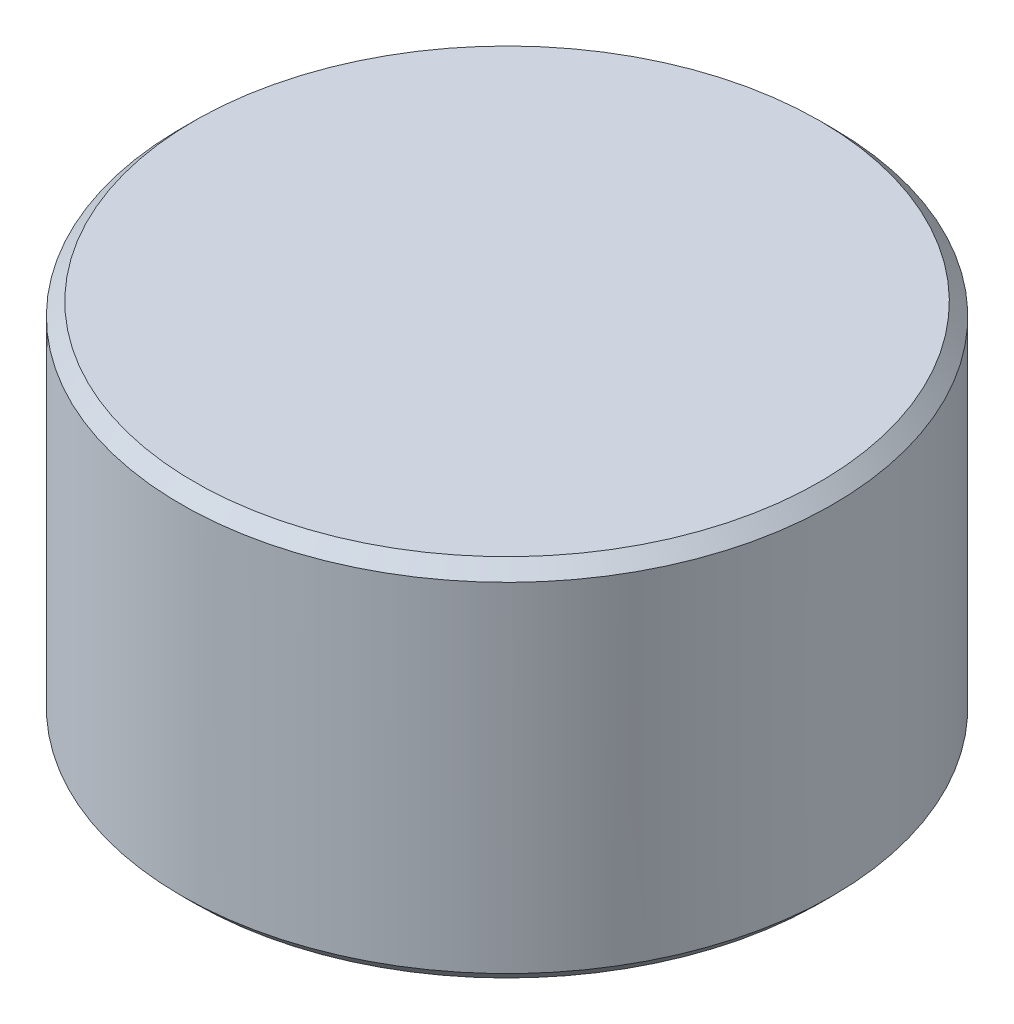
ISO-10303-21;
HEADER;
FILE_DESCRIPTION(('STEP AP214'),'2;1');
FILE_NAME('part.step','',(''),(''),'','','');
FILE_SCHEMA(('AUTOMOTIVE_DESIGN { 1 0 10303 214 1 1 1 1 }'));
ENDSEC;
DATA;
#1=APPLICATION_CONTEXT('core data for automotive mechanical design processes');
#2=APPLICATION_PROTOCOL_DEFINITION('international standard','automotive_design',2000,#1);
#3=PRODUCT_CONTEXT('',#1,'mechanical');
#4=PRODUCT('Part','Part','',(#3));
#5=PRODUCT_RELATED_PRODUCT_CATEGORY('part','',(#4));
#6=PRODUCT_DEFINITION_FORMATION('','',#4);
#7=PRODUCT_DEFINITION_CONTEXT('part definition',#1,'design');
#8=PRODUCT_DEFINITION('design','',#6,#7);
#9=PRODUCT_DEFINITION_SHAPE('','',#8);
#10=(LENGTH_UNIT() NAMED_UNIT(*) SI_UNIT(.MILLI.,.METRE.));
#11=(NAMED_UNIT(*) PLANE_ANGLE_UNIT() SI_UNIT($,.RADIAN.));
#12=(NAMED_UNIT(*) SI_UNIT($,.STERADIAN.) SOLID_ANGLE_UNIT());
#13=UNCERTAINTY_MEASURE_WITH_UNIT(LENGTH_MEASURE(1.E-05),#10,'distance_accuracy_value','');
#14=(GEOMETRIC_REPRESENTATION_CONTEXT(3) GLOBAL_UNCERTAINTY_ASSIGNED_CONTEXT((#13)) GLOBAL_UNIT_ASSIGNED_CONTEXT((#10,
#11,#12)) REPRESENTATION_CONTEXT('',''));
#15=CARTESIAN_POINT('',(0.,0.,0.));
#16=DIRECTION('',(0.,0.,1.));
#17=DIRECTION('',(1.,0.,0.));
#18=AXIS2_PLACEMENT_3D('',#15,#16,#17);
#19=CARTESIAN_POINT('',(0.,2.8,0.));
#20=DIRECTION('',(0.,-1.,0.));
#21=DIRECTION('',(0.,0.,-1.));
#22=AXIS2_PLACEMENT_3D('',#19,#20,#21);
#23=CYLINDRICAL_SURFACE('',#22,2.5);
#24=CARTESIAN_POINT('',(0.,0.0999999999999981,0.));
#25=DIRECTION('',(0.,1.,0.));
#26=DIRECTION('',(0.,0.,1.));
#27=AXIS2_PLACEMENT_3D('',#24,#25,#26);
#28=CIRCLE('',#27,2.5);
#29=CARTESIAN_POINT('',(0.,0.0999999999999981,2.5));
#30=VERTEX_POINT('',#29);
#31=EDGE_CURVE('E42',#30,#30,#28,.T.);
#32=ORIENTED_EDGE('',*,*,#31,.T.);
#33=EDGE_LOOP('',(#32));
#34=FACE_BOUND('',#33,.T.);
#35=CARTESIAN_POINT('',(0.,2.7,0.));
#36=DIRECTION('',(0.,1.,0.));
#37=DIRECTION('',(0.,0.,1.));
#38=AXIS2_PLACEMENT_3D('',#35,#36,#37);
#39=CIRCLE('',#38,2.5);
#40=CARTESIAN_POINT('',(0.,2.7,-2.5));
#41=VERTEX_POINT('',#40);
#42=EDGE_CURVE('E46',#41,#41,#39,.F.);
#43=ORIENTED_EDGE('',*,*,#42,.T.);
#44=EDGE_LOOP('',(#43));
#45=FACE_BOUND('',#44,.T.);
#46=ADVANCED_FACE('F31',(#34,#45),#23,.T.);
#47=CARTESIAN_POINT('',(0.,2.8,0.));
#48=DIRECTION('',(0.,1.,0.));
#49=DIRECTION('',(0.,0.,1.));
#50=AXIS2_PLACEMENT_3D('',#47,#48,#49);
#51=PLANE('',#50);
#52=CARTESIAN_POINT('',(0.,2.8,0.));
#53=DIRECTION('',(0.,1.,0.));
#54=DIRECTION('',(0.,0.,1.));
#55=AXIS2_PLACEMENT_3D('',#52,#53,#54);
#56=CIRCLE('',#55,2.4);
#57=CARTESIAN_POINT('',(0.,2.8,-2.4));
#58=VERTEX_POINT('',#57);
#59=EDGE_CURVE('E10',#58,#58,#56,.T.);
#60=ORIENTED_EDGE('',*,*,#59,.T.);
#61=EDGE_LOOP('',(#60));
#62=FACE_BOUND('',#61,.T.);
#63=ADVANCED_FACE('F62',(#62),#51,.T.);
#64=CARTESIAN_POINT('',(0.,0.,0.));
#65=DIRECTION('',(0.,1.,0.));
#66=DIRECTION('',(0.,0.,1.));
#67=AXIS2_PLACEMENT_3D('',#64,#65,#66);
#68=PLANE('',#67);
#69=CARTESIAN_POINT('',(0.,0.,0.));
#70=DIRECTION('',(0.,1.,0.));
#71=DIRECTION('',(0.,0.,1.));
#72=AXIS2_PLACEMENT_3D('',#69,#70,#71);
#73=CIRCLE('',#72,2.4);
#74=CARTESIAN_POINT('',(0.,0.,2.4));
#75=VERTEX_POINT('',#74);
#76=EDGE_CURVE('E38',#75,#75,#73,.F.);
#77=ORIENTED_EDGE('',*,*,#76,.T.);
#78=EDGE_LOOP('',(#77));
#79=FACE_BOUND('',#78,.T.);
#80=ADVANCED_FACE('F59',(#79),#68,.F.);
#81=CARTESIAN_POINT('',(0.,0.0999999999999981,0.));
#82=DIRECTION('',(0.,1.,0.));
#83=DIRECTION('',(0.,0.,1.));
#84=AXIS2_PLACEMENT_3D('',#81,#82,#83);
#85=CONICAL_SURFACE('',#84,2.5,0.785398163397453);
#86=ORIENTED_EDGE('',*,*,#76,.F.);
#87=EDGE_LOOP('',(#86));
#88=FACE_BOUND('',#87,.T.);
#89=ORIENTED_EDGE('',*,*,#31,.F.);
#90=EDGE_LOOP('',(#89));
#91=FACE_BOUND('',#90,.T.);
#92=ADVANCED_FACE('F55',(#88,#91),#85,.T.);
#93=CARTESIAN_POINT('',(0.,2.8,0.));
#94=DIRECTION('',(0.,-1.,0.));
#95=DIRECTION('',(0.,0.,-1.));
#96=AXIS2_PLACEMENT_3D('',#93,#94,#95);
#97=CONICAL_SURFACE('',#96,2.4,0.785398163397442);
#98=CARTESIAN_POINT('',(0.,2.7,-2.5));
#99=CARTESIAN_POINT('',(0.,2.70104166666667,-2.49895833333333));
#100=CARTESIAN_POINT('',(0.,2.70208333333333,-2.49791666666667));
#101=CARTESIAN_POINT('',(0.,2.70416666666667,-2.49583333333333));
#102=CARTESIAN_POINT('',(0.,2.70520833333333,-2.49479166666667));
#103=CARTESIAN_POINT('',(0.,2.70729166666667,-2.49270833333333));
#104=CARTESIAN_POINT('',(0.,2.70833333333333,-2.49166666666667));
#105=CARTESIAN_POINT('',(0.,2.71041666666667,-2.48958333333333));
#106=CARTESIAN_POINT('',(0.,2.71145833333333,-2.48854166666667));
#107=CARTESIAN_POINT('',(0.,2.71354166666667,-2.48645833333333));
#108=CARTESIAN_POINT('',(0.,2.71458333333333,-2.48541666666667));
#109=CARTESIAN_POINT('',(0.,2.71666666666667,-2.48333333333333));
#110=CARTESIAN_POINT('',(0.,2.71770833333333,-2.48229166666667));
#111=CARTESIAN_POINT('',(0.,2.71979166666667,-2.48020833333333));
#112=CARTESIAN_POINT('',(0.,2.72083333333333,-2.47916666666667));
#113=CARTESIAN_POINT('',(0.,2.72291666666667,-2.47708333333333));
#114=CARTESIAN_POINT('',(0.,2.72395833333333,-2.47604166666667));
#115=CARTESIAN_POINT('',(0.,2.72604166666667,-2.47395833333333));
#116=CARTESIAN_POINT('',(0.,2.72708333333333,-2.47291666666667));
#117=CARTESIAN_POINT('',(0.,2.72916666666667,-2.47083333333333));
#118=CARTESIAN_POINT('',(0.,2.73020833333333,-2.46979166666667));
#119=CARTESIAN_POINT('',(0.,2.73229166666667,-2.46770833333333));
#120=CARTESIAN_POINT('',(0.,2.73333333333333,-2.46666666666667));
#121=CARTESIAN_POINT('',(0.,2.73541666666667,-2.46458333333333));
#122=CARTESIAN_POINT('',(0.,2.73645833333333,-2.46354166666667));
#123=CARTESIAN_POINT('',(0.,2.73854166666667,-2.46145833333333));
#124=CARTESIAN_POINT('',(0.,2.73958333333333,-2.46041666666667));
#125=CARTESIAN_POINT('',(0.,2.74166666666667,-2.45833333333333));
#126=CARTESIAN_POINT('',(0.,2.74270833333333,-2.45729166666667));
#127=CARTESIAN_POINT('',(0.,2.74479166666667,-2.45520833333333));
#128=CARTESIAN_POINT('',(0.,2.74583333333333,-2.45416666666667));
#129=CARTESIAN_POINT('',(0.,2.74791666666667,-2.45208333333333));
#130=CARTESIAN_POINT('',(0.,2.74895833333333,-2.45104166666667));
#131=CARTESIAN_POINT('',(0.,2.75104166666667,-2.44895833333333));
#132=CARTESIAN_POINT('',(0.,2.75208333333333,-2.44791666666667));
#133=CARTESIAN_POINT('',(0.,2.75416666666667,-2.44583333333333));
#134=CARTESIAN_POINT('',(0.,2.75520833333333,-2.44479166666667));
#135=CARTESIAN_POINT('',(0.,2.75729166666667,-2.44270833333333));
#136=CARTESIAN_POINT('',(0.,2.75833333333333,-2.44166666666667));
#137=CARTESIAN_POINT('',(0.,2.76041666666667,-2.43958333333333));
#138=CARTESIAN_POINT('',(0.,2.76145833333333,-2.43854166666667));
#139=CARTESIAN_POINT('',(0.,2.76354166666667,-2.43645833333333));
#140=CARTESIAN_POINT('',(0.,2.76458333333333,-2.43541666666667));
#141=CARTESIAN_POINT('',(0.,2.76666666666667,-2.43333333333333));
#142=CARTESIAN_POINT('',(0.,2.76770833333333,-2.43229166666667));
#143=CARTESIAN_POINT('',(0.,2.76979166666667,-2.43020833333333));
#144=CARTESIAN_POINT('',(0.,2.77083333333333,-2.42916666666667));
#145=CARTESIAN_POINT('',(0.,2.77291666666667,-2.42708333333333));
#146=CARTESIAN_POINT('',(0.,2.77395833333333,-2.42604166666667));
#147=CARTESIAN_POINT('',(0.,2.77604166666667,-2.42395833333333));
#148=CARTESIAN_POINT('',(0.,2.77708333333333,-2.42291666666667));
#149=CARTESIAN_POINT('',(0.,2.77916666666667,-2.42083333333333));
#150=CARTESIAN_POINT('',(0.,2.78020833333333,-2.41979166666667));
#151=CARTESIAN_POINT('',(0.,2.78229166666667,-2.41770833333333));
#152=CARTESIAN_POINT('',(0.,2.78333333333333,-2.41666666666667));
#153=CARTESIAN_POINT('',(0.,2.78541666666667,-2.41458333333333));
#154=CARTESIAN_POINT('',(0.,2.78645833333333,-2.41354166666667));
#155=CARTESIAN_POINT('',(0.,2.78854166666667,-2.41145833333333));
#156=CARTESIAN_POINT('',(0.,2.78958333333333,-2.41041666666667));
#157=CARTESIAN_POINT('',(0.,2.79166666666667,-2.40833333333333));
#158=CARTESIAN_POINT('',(0.,2.79270833333333,-2.40729166666667));
#159=CARTESIAN_POINT('',(0.,2.79479166666667,-2.40520833333333));
#160=CARTESIAN_POINT('',(0.,2.79583333333333,-2.40416666666667));
#161=CARTESIAN_POINT('',(0.,2.79791666666667,-2.40208333333333));
#162=CARTESIAN_POINT('',(0.,2.79895833333333,-2.40104166666667));
#163=CARTESIAN_POINT('',(0.,2.8,-2.4));
#164=B_SPLINE_CURVE_WITH_KNOTS('',3,(#98,#99,#100,#101,#102,#103,#104,#105,#106,#107,#108,#109,
#110,#111,#112,#113,#114,#115,#116,#117,#118,#119,#120,#121,#122,#123,#124,#125,#126,#127,#128,
#129,#130,#131,#132,#133,#134,#135,#136,#137,#138,#139,#140,#141,#142,#143,#144,#145,#146,#147,
#148,#149,#150,#151,#152,#153,#154,#155,#156,#157,#158,#159,#160,#161,#162,#163),.UNSPECIFIED.,
.F.,.F.,(4,2,2,2,2,2,2,2,2,2,2,2,2,2,2,2,2,2,2,2,2,2,2,2,2,2,2,2,2,2,2,2,4),(0.,
0.00441941738241605,0.0088388347648321,0.0132582521472481,0.0176776695296639,0.0220970869120796,
0.0265165042944957,0.0309359216769114,0.0353553390593275,0.0397747564417435,0.0441941738241589,
0.048613591206575,0.053033008588991,0.0574524259714068,0.0618718433538225,0.0662912607362386,
0.0707106781186543,0.0751300955010704,0.0795495128834864,0.0839689302659022,0.0883883476483179,
0.0928077650307339,0.09722718241315,0.101646599795565,0.106066017177981,0.110485434560398,
0.114904851942813,0.119324269325229,0.123743686707645,0.128163104090061,0.132582521472477,
0.137001938854893,0.141421356237309),.UNSPECIFIED.);
#165=EDGE_CURVE('BSEAM33',#41,#58,#164,.T.);
#166=ORIENTED_EDGE('',*,*,#42,.F.);
#167=ORIENTED_EDGE('',*,*,#59,.F.);
#168=ORIENTED_EDGE('',*,*,#165,.T.);
#169=ORIENTED_EDGE('',*,*,#165,.F.);
#170=EDGE_LOOP('',(#166,#168,#167,#169));
#171=FACE_BOUND('',#170,.T.);
#172=ADVANCED_FACE('F33',(#171),#97,.T.);
#173=CLOSED_SHELL('',(#46,#63,#80,#92,#172));
#174=MANIFOLD_SOLID_BREP('B2',#173);
#175=ADVANCED_BREP_SHAPE_REPRESENTATION('',(#18,#174),#14);
#176=SHAPE_DEFINITION_REPRESENTATION(#9,#175);
ENDSEC;
END-ISO-10303-21;
